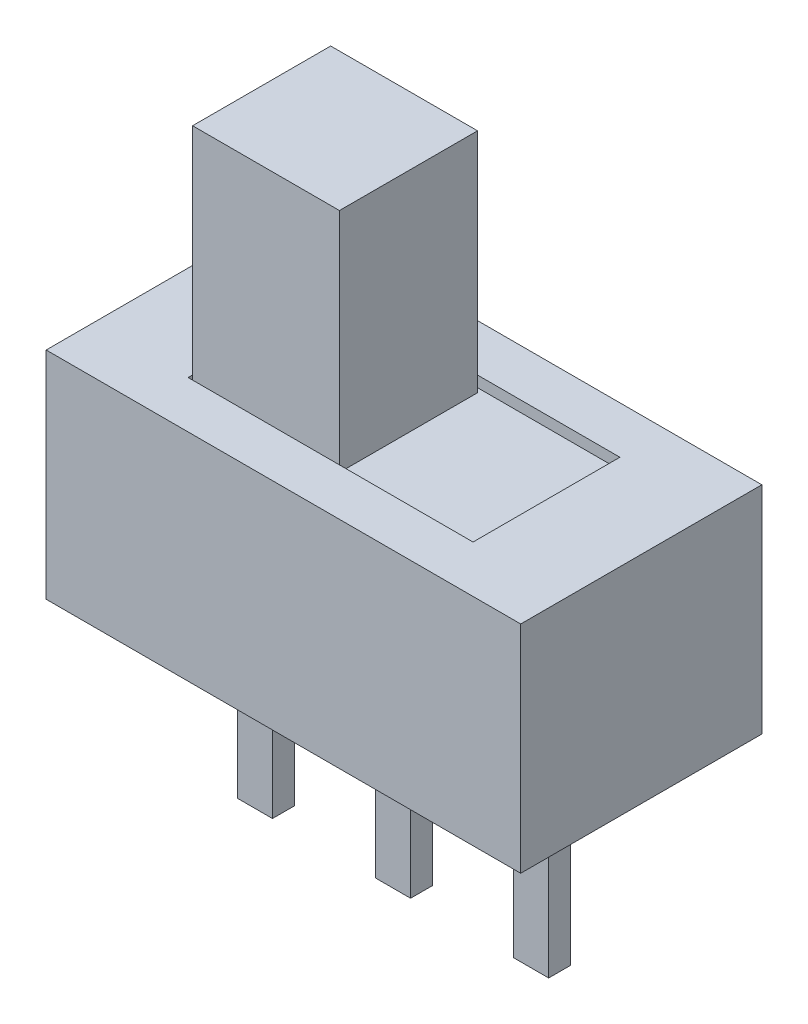
ISO-10303-21;
HEADER;
FILE_DESCRIPTION(('STEP AP214'),'2;1');
FILE_NAME('part.step','',(''),(''),'','','');
FILE_SCHEMA(('AUTOMOTIVE_DESIGN { 1 0 10303 214 1 1 1 1 }'));
ENDSEC;
DATA;
#1=APPLICATION_CONTEXT('core data for automotive mechanical design processes');
#2=APPLICATION_PROTOCOL_DEFINITION('international standard','automotive_design',2000,#1);
#3=PRODUCT_CONTEXT('',#1,'mechanical');
#4=PRODUCT('Part','Part','',(#3));
#5=PRODUCT_RELATED_PRODUCT_CATEGORY('part','',(#4));
#6=PRODUCT_DEFINITION_FORMATION('','',#4);
#7=PRODUCT_DEFINITION_CONTEXT('part definition',#1,'design');
#8=PRODUCT_DEFINITION('design','',#6,#7);
#9=PRODUCT_DEFINITION_SHAPE('','',#8);
#10=(LENGTH_UNIT() NAMED_UNIT(*) SI_UNIT(.MILLI.,.METRE.));
#11=(NAMED_UNIT(*) PLANE_ANGLE_UNIT() SI_UNIT($,.RADIAN.));
#12=(NAMED_UNIT(*) SI_UNIT($,.STERADIAN.) SOLID_ANGLE_UNIT());
#13=UNCERTAINTY_MEASURE_WITH_UNIT(LENGTH_MEASURE(1.E-05),#10,'distance_accuracy_value','');
#14=(GEOMETRIC_REPRESENTATION_CONTEXT(3) GLOBAL_UNCERTAINTY_ASSIGNED_CONTEXT((#13)) GLOBAL_UNIT_ASSIGNED_CONTEXT((#10,
#11,#12)) REPRESENTATION_CONTEXT('',''));
#15=CARTESIAN_POINT('',(0.,0.,0.));
#16=DIRECTION('',(0.,0.,1.));
#17=DIRECTION('',(1.,0.,0.));
#18=AXIS2_PLACEMENT_3D('',#15,#16,#17);
#19=CARTESIAN_POINT('',(0.,0.,0.));
#20=DIRECTION('',(0.,1.,0.));
#21=DIRECTION('',(0.,0.,1.));
#22=AXIS2_PLACEMENT_3D('',#19,#20,#21);
#23=PLANE('',#22);
#24=DIRECTION('',(0.,0.,1.));
#25=VECTOR('',#24,1.);
#26=CARTESIAN_POINT('',(3.6068,0.,0.254));
#27=LINE('',#26,#25);
#28=CARTESIAN_POINT('',(3.6068,0.,-0.254));
#29=VERTEX_POINT('',#28);
#30=CARTESIAN_POINT('',(3.6068,0.,0.254));
#31=VERTEX_POINT('',#30);
#32=EDGE_CURVE('E251',#29,#31,#27,.T.);
#33=ORIENTED_EDGE('',*,*,#32,.F.);
#34=DIRECTION('',(1.,0.,0.));
#35=VECTOR('',#34,1.);
#36=CARTESIAN_POINT('',(2.794,0.,-0.254));
#37=LINE('',#36,#35);
#38=CARTESIAN_POINT('',(2.794,0.,-0.254));
#39=VERTEX_POINT('',#38);
#40=EDGE_CURVE('E217',#39,#29,#37,.T.);
#41=ORIENTED_EDGE('',*,*,#40,.F.);
#42=DIRECTION('',(0.,0.,-1.));
#43=VECTOR('',#42,1.);
#44=CARTESIAN_POINT('',(2.794,0.,0.254));
#45=LINE('',#44,#43);
#46=CARTESIAN_POINT('',(2.794,0.,0.254));
#47=VERTEX_POINT('',#46);
#48=EDGE_CURVE('E239',#47,#39,#45,.T.);
#49=ORIENTED_EDGE('',*,*,#48,.F.);
#50=DIRECTION('',(-1.,0.,0.));
#51=VECTOR('',#50,1.);
#52=CARTESIAN_POINT('',(2.794,0.,0.254));
#53=LINE('',#52,#51);
#54=EDGE_CURVE('E245',#31,#47,#53,.T.);
#55=ORIENTED_EDGE('',*,*,#54,.F.);
#56=EDGE_LOOP('',(#33,#41,#49,#55));
#57=FACE_BOUND('',#56,.T.);
#58=DIRECTION('',(0.,0.,-1.));
#59=VECTOR('',#58,1.);
#60=CARTESIAN_POINT('',(5.4991,0.,-2.794));
#61=LINE('',#60,#59);
#62=CARTESIAN_POINT('',(5.4991,0.,2.794));
#63=VERTEX_POINT('',#62);
#64=CARTESIAN_POINT('',(5.4991,0.,-2.794));
#65=VERTEX_POINT('',#64);
#66=EDGE_CURVE('E342',#63,#65,#61,.T.);
#67=ORIENTED_EDGE('',*,*,#66,.F.);
#68=DIRECTION('',(1.,0.,0.));
#69=VECTOR('',#68,1.);
#70=CARTESIAN_POINT('',(-5.4991,0.,2.794));
#71=LINE('',#70,#69);
#72=CARTESIAN_POINT('',(-5.4991,0.,2.794));
#73=VERTEX_POINT('',#72);
#74=EDGE_CURVE('E353',#73,#63,#71,.T.);
#75=ORIENTED_EDGE('',*,*,#74,.F.);
#76=DIRECTION('',(0.,0.,1.));
#77=VECTOR('',#76,1.);
#78=CARTESIAN_POINT('',(-5.4991,0.,-2.794));
#79=LINE('',#78,#77);
#80=CARTESIAN_POINT('',(-5.4991,0.,-2.794));
#81=VERTEX_POINT('',#80);
#82=EDGE_CURVE('E364',#81,#73,#79,.T.);
#83=ORIENTED_EDGE('',*,*,#82,.F.);
#84=DIRECTION('',(-1.,0.,0.));
#85=VECTOR('',#84,1.);
#86=CARTESIAN_POINT('',(-5.4991,0.,-2.794));
#87=LINE('',#86,#85);
#88=EDGE_CURVE('E362',#65,#81,#87,.T.);
#89=ORIENTED_EDGE('',*,*,#88,.F.);
#90=EDGE_LOOP('',(#67,#75,#83,#89));
#91=FACE_BOUND('',#90,.T.);
#92=DIRECTION('',(0.,0.,1.));
#93=VECTOR('',#92,1.);
#94=CARTESIAN_POINT('',(0.4064,0.,0.254));
#95=LINE('',#94,#93);
#96=CARTESIAN_POINT('',(0.4064,0.,-0.254));
#97=VERTEX_POINT('',#96);
#98=CARTESIAN_POINT('',(0.4064,0.,0.254));
#99=VERTEX_POINT('',#98);
#100=EDGE_CURVE('E254',#97,#99,#95,.T.);
#101=ORIENTED_EDGE('',*,*,#100,.F.);
#102=DIRECTION('',(1.,0.,0.));
#103=VECTOR('',#102,1.);
#104=CARTESIAN_POINT('',(-0.4064,0.,-0.254));
#105=LINE('',#104,#103);
#106=CARTESIAN_POINT('',(-0.4064,0.,-0.254));
#107=VERTEX_POINT('',#106);
#108=EDGE_CURVE('E259',#107,#97,#105,.T.);
#109=ORIENTED_EDGE('',*,*,#108,.F.);
#110=DIRECTION('',(0.,0.,-1.));
#111=VECTOR('',#110,1.);
#112=CARTESIAN_POINT('',(-0.4064,0.,0.254));
#113=LINE('',#112,#111);
#114=CARTESIAN_POINT('',(-0.4064,0.,0.254));
#115=VERTEX_POINT('',#114);
#116=EDGE_CURVE('E271',#115,#107,#113,.T.);
#117=ORIENTED_EDGE('',*,*,#116,.F.);
#118=DIRECTION('',(-1.,0.,0.));
#119=VECTOR('',#118,1.);
#120=CARTESIAN_POINT('',(-0.4064,0.,0.254));
#121=LINE('',#120,#119);
#122=EDGE_CURVE('E268',#99,#115,#121,.T.);
#123=ORIENTED_EDGE('',*,*,#122,.F.);
#124=EDGE_LOOP('',(#101,#109,#117,#123));
#125=FACE_BOUND('',#124,.T.);
#126=DIRECTION('',(0.,0.,1.));
#127=VECTOR('',#126,1.);
#128=CARTESIAN_POINT('',(-2.794,0.,0.254));
#129=LINE('',#128,#127);
#130=CARTESIAN_POINT('',(-2.794,0.,-0.254));
#131=VERTEX_POINT('',#130);
#132=CARTESIAN_POINT('',(-2.794,0.,0.254));
#133=VERTEX_POINT('',#132);
#134=EDGE_CURVE('E215',#131,#133,#129,.T.);
#135=ORIENTED_EDGE('',*,*,#134,.F.);
#136=DIRECTION('',(1.,0.,0.));
#137=VECTOR('',#136,1.);
#138=CARTESIAN_POINT('',(-3.6068,0.,-0.254));
#139=LINE('',#138,#137);
#140=CARTESIAN_POINT('',(-3.6068,0.,-0.254));
#141=VERTEX_POINT('',#140);
#142=EDGE_CURVE('E204',#141,#131,#139,.T.);
#143=ORIENTED_EDGE('',*,*,#142,.F.);
#144=DIRECTION('',(0.,0.,-1.));
#145=VECTOR('',#144,1.);
#146=CARTESIAN_POINT('',(-3.6068,0.,0.254));
#147=LINE('',#146,#145);
#148=CARTESIAN_POINT('',(-3.6068,0.,0.254));
#149=VERTEX_POINT('',#148);
#150=EDGE_CURVE('E54',#149,#141,#147,.T.);
#151=ORIENTED_EDGE('',*,*,#150,.F.);
#152=DIRECTION('',(-1.,0.,0.));
#153=VECTOR('',#152,1.);
#154=CARTESIAN_POINT('',(-3.6068,0.,0.254));
#155=LINE('',#154,#153);
#156=EDGE_CURVE('E49',#133,#149,#155,.T.);
#157=ORIENTED_EDGE('',*,*,#156,.F.);
#158=EDGE_LOOP('',(#135,#143,#151,#157));
#159=FACE_BOUND('',#158,.T.);
#160=ADVANCED_FACE('F34',(#57,#91,#125,#159),#23,.F.);
#161=CARTESIAN_POINT('',(0.,4.7498,0.));
#162=DIRECTION('',(0.,1.,0.));
#163=DIRECTION('',(0.,0.,1.));
#164=AXIS2_PLACEMENT_3D('',#161,#162,#163);
#165=PLANE('',#164);
#166=DIRECTION('',(0.,0.,-1.));
#167=VECTOR('',#166,1.);
#168=CARTESIAN_POINT('',(3.302,4.7498,-1.7018));
#169=LINE('',#168,#167);
#170=CARTESIAN_POINT('',(3.302,4.7498,1.7018));
#171=VERTEX_POINT('',#170);
#172=CARTESIAN_POINT('',(3.302,4.7498,-1.7018));
#173=VERTEX_POINT('',#172);
#174=EDGE_CURVE('E317',#171,#173,#169,.T.);
#175=ORIENTED_EDGE('',*,*,#174,.T.);
#176=DIRECTION('',(-1.,0.,0.));
#177=VECTOR('',#176,1.);
#178=CARTESIAN_POINT('',(-3.302,4.7498,-1.7018));
#179=LINE('',#178,#177);
#180=CARTESIAN_POINT('',(-3.302,4.7498,-1.7018));
#181=VERTEX_POINT('',#180);
#182=EDGE_CURVE('E320',#173,#181,#179,.T.);
#183=ORIENTED_EDGE('',*,*,#182,.T.);
#184=DIRECTION('',(0.,0.,1.));
#185=VECTOR('',#184,1.);
#186=CARTESIAN_POINT('',(-3.302,4.7498,-1.7018));
#187=LINE('',#186,#185);
#188=CARTESIAN_POINT('',(-3.302,4.7498,1.7018));
#189=VERTEX_POINT('',#188);
#190=EDGE_CURVE('E324',#181,#189,#187,.T.);
#191=ORIENTED_EDGE('',*,*,#190,.T.);
#192=DIRECTION('',(1.,0.,0.));
#193=VECTOR('',#192,1.);
#194=CARTESIAN_POINT('',(-3.302,4.7498,1.7018));
#195=LINE('',#194,#193);
#196=EDGE_CURVE('E327',#189,#171,#195,.T.);
#197=ORIENTED_EDGE('',*,*,#196,.T.);
#198=EDGE_LOOP('',(#175,#183,#191,#197));
#199=FACE_BOUND('',#198,.T.);
#200=DIRECTION('',(-1.,0.,0.));
#201=VECTOR('',#200,1.);
#202=CARTESIAN_POINT('',(-3.29946,4.7498,-1.6002));
#203=LINE('',#202,#201);
#204=CARTESIAN_POINT('',(0.10414,4.7498,-1.6002));
#205=VERTEX_POINT('',#204);
#206=CARTESIAN_POINT('',(-3.29946,4.7498,-1.6002));
#207=VERTEX_POINT('',#206);
#208=EDGE_CURVE('E301',#205,#207,#203,.T.);
#209=ORIENTED_EDGE('',*,*,#208,.F.);
#210=DIRECTION('',(0.,0.,-1.));
#211=VECTOR('',#210,1.);
#212=CARTESIAN_POINT('',(0.10414,4.7498,-1.6002));
#213=LINE('',#212,#211);
#214=CARTESIAN_POINT('',(0.10414,4.7498,1.6002));
#215=VERTEX_POINT('',#214);
#216=EDGE_CURVE('E287',#215,#205,#213,.T.);
#217=ORIENTED_EDGE('',*,*,#216,.F.);
#218=DIRECTION('',(1.,0.,0.));
#219=VECTOR('',#218,1.);
#220=CARTESIAN_POINT('',(-3.29946,4.7498,1.6002));
#221=LINE('',#220,#219);
#222=CARTESIAN_POINT('',(-3.29946,4.7498,1.6002));
#223=VERTEX_POINT('',#222);
#224=EDGE_CURVE('E292',#223,#215,#221,.T.);
#225=ORIENTED_EDGE('',*,*,#224,.F.);
#226=DIRECTION('',(0.,0.,1.));
#227=VECTOR('',#226,1.);
#228=CARTESIAN_POINT('',(-3.29946,4.7498,-1.6002));
#229=LINE('',#228,#227);
#230=EDGE_CURVE('E303',#207,#223,#229,.T.);
#231=ORIENTED_EDGE('',*,*,#230,.F.);
#232=EDGE_LOOP('',(#209,#217,#225,#231));
#233=FACE_BOUND('',#232,.T.);
#234=ADVANCED_FACE('F399',(#199,#233),#165,.T.);
#235=CARTESIAN_POINT('',(5.4991,5.0038,-2.794));
#236=DIRECTION('',(-1.,0.,0.));
#237=DIRECTION('',(0.,0.,1.));
#238=AXIS2_PLACEMENT_3D('',#235,#236,#237);
#239=PLANE('',#238);
#240=ORIENTED_EDGE('',*,*,#66,.T.);
#241=DIRECTION('',(0.,-1.,0.));
#242=VECTOR('',#241,1.);
#243=CARTESIAN_POINT('',(5.4991,5.0038,-2.794));
#244=LINE('',#243,#242);
#245=CARTESIAN_POINT('',(5.4991,5.0038,-2.794));
#246=VERTEX_POINT('',#245);
#247=EDGE_CURVE('E11',#246,#65,#244,.T.);
#248=ORIENTED_EDGE('',*,*,#247,.F.);
#249=DIRECTION('',(0.,0.,-1.));
#250=VECTOR('',#249,1.);
#251=CARTESIAN_POINT('',(5.4991,5.0038,-2.794));
#252=LINE('',#251,#250);
#253=CARTESIAN_POINT('',(5.4991,5.0038,2.794));
#254=VERTEX_POINT('',#253);
#255=EDGE_CURVE('E349',#254,#246,#252,.T.);
#256=ORIENTED_EDGE('',*,*,#255,.F.);
#257=DIRECTION('',(0.,-1.,0.));
#258=VECTOR('',#257,1.);
#259=CARTESIAN_POINT('',(5.4991,5.0038,2.794));
#260=LINE('',#259,#258);
#261=EDGE_CURVE('E359',#254,#63,#260,.T.);
#262=ORIENTED_EDGE('',*,*,#261,.T.);
#263=EDGE_LOOP('',(#240,#248,#256,#262));
#264=FACE_BOUND('',#263,.T.);
#265=ADVANCED_FACE('F36',(#264),#239,.F.);
#266=CARTESIAN_POINT('',(-5.4991,5.0038,-2.794));
#267=DIRECTION('',(0.,0.,1.));
#268=DIRECTION('',(1.,0.,0.));
#269=AXIS2_PLACEMENT_3D('',#266,#267,#268);
#270=PLANE('',#269);
#271=ORIENTED_EDGE('',*,*,#88,.T.);
#272=DIRECTION('',(0.,-1.,0.));
#273=VECTOR('',#272,1.);
#274=CARTESIAN_POINT('',(-5.4991,5.0038,-2.794));
#275=LINE('',#274,#273);
#276=CARTESIAN_POINT('',(-5.4991,5.0038,-2.794));
#277=VERTEX_POINT('',#276);
#278=EDGE_CURVE('E42',#277,#81,#275,.T.);
#279=ORIENTED_EDGE('',*,*,#278,.F.);
#280=DIRECTION('',(-1.,0.,0.));
#281=VECTOR('',#280,1.);
#282=CARTESIAN_POINT('',(-5.4991,5.0038,-2.794));
#283=LINE('',#282,#281);
#284=EDGE_CURVE('E352',#246,#277,#283,.T.);
#285=ORIENTED_EDGE('',*,*,#284,.F.);
#286=ORIENTED_EDGE('',*,*,#247,.T.);
#287=EDGE_LOOP('',(#271,#279,#285,#286));
#288=FACE_BOUND('',#287,.T.);
#289=ADVANCED_FACE('F392',(#288),#270,.F.);
#290=CARTESIAN_POINT('',(-5.4991,5.0038,-2.794));
#291=DIRECTION('',(1.,0.,0.));
#292=DIRECTION('',(0.,0.,-1.));
#293=AXIS2_PLACEMENT_3D('',#290,#291,#292);
#294=PLANE('',#293);
#295=ORIENTED_EDGE('',*,*,#82,.T.);
#296=DIRECTION('',(0.,-1.,0.));
#297=VECTOR('',#296,1.);
#298=CARTESIAN_POINT('',(-5.4991,5.0038,2.794));
#299=LINE('',#298,#297);
#300=CARTESIAN_POINT('',(-5.4991,5.0038,2.794));
#301=VERTEX_POINT('',#300);
#302=EDGE_CURVE('E369',#301,#73,#299,.T.);
#303=ORIENTED_EDGE('',*,*,#302,.F.);
#304=DIRECTION('',(0.,0.,1.));
#305=VECTOR('',#304,1.);
#306=CARTESIAN_POINT('',(-5.4991,5.0038,-2.794));
#307=LINE('',#306,#305);
#308=EDGE_CURVE('E355',#277,#301,#307,.T.);
#309=ORIENTED_EDGE('',*,*,#308,.F.);
#310=ORIENTED_EDGE('',*,*,#278,.T.);
#311=EDGE_LOOP('',(#295,#303,#309,#310));
#312=FACE_BOUND('',#311,.T.);
#313=ADVANCED_FACE('F376',(#312),#294,.F.);
#314=CARTESIAN_POINT('',(-5.4991,5.0038,2.794));
#315=DIRECTION('',(0.,0.,-1.));
#316=DIRECTION('',(-1.,0.,0.));
#317=AXIS2_PLACEMENT_3D('',#314,#315,#316);
#318=PLANE('',#317);
#319=ORIENTED_EDGE('',*,*,#74,.T.);
#320=ORIENTED_EDGE('',*,*,#261,.F.);
#321=DIRECTION('',(1.,0.,0.));
#322=VECTOR('',#321,1.);
#323=CARTESIAN_POINT('',(-5.4991,5.0038,2.794));
#324=LINE('',#323,#322);
#325=EDGE_CURVE('E357',#301,#254,#324,.T.);
#326=ORIENTED_EDGE('',*,*,#325,.F.);
#327=ORIENTED_EDGE('',*,*,#302,.T.);
#328=EDGE_LOOP('',(#319,#320,#326,#327));
#329=FACE_BOUND('',#328,.T.);
#330=ADVANCED_FACE('F385',(#329),#318,.F.);
#331=CARTESIAN_POINT('',(0.,5.0038,0.));
#332=DIRECTION('',(0.,1.,0.));
#333=DIRECTION('',(0.,0.,1.));
#334=AXIS2_PLACEMENT_3D('',#331,#332,#333);
#335=PLANE('',#334);
#336=DIRECTION('',(0.,0.,-1.));
#337=VECTOR('',#336,1.);
#338=CARTESIAN_POINT('',(3.302,5.0038,-1.7018));
#339=LINE('',#338,#337);
#340=CARTESIAN_POINT('',(3.302,5.0038,1.7018));
#341=VERTEX_POINT('',#340);
#342=CARTESIAN_POINT('',(3.302,5.0038,-1.7018));
#343=VERTEX_POINT('',#342);
#344=EDGE_CURVE('E316',#341,#343,#339,.T.);
#345=ORIENTED_EDGE('',*,*,#344,.F.);
#346=DIRECTION('',(1.,0.,0.));
#347=VECTOR('',#346,1.);
#348=CARTESIAN_POINT('',(-3.302,5.0038,1.7018));
#349=LINE('',#348,#347);
#350=CARTESIAN_POINT('',(-3.302,5.0038,1.7018));
#351=VERTEX_POINT('',#350);
#352=EDGE_CURVE('E321',#351,#341,#349,.T.);
#353=ORIENTED_EDGE('',*,*,#352,.F.);
#354=DIRECTION('',(0.,0.,1.));
#355=VECTOR('',#354,1.);
#356=CARTESIAN_POINT('',(-3.302,5.0038,-1.7018));
#357=LINE('',#356,#355);
#358=CARTESIAN_POINT('',(-3.302,5.0038,-1.7018));
#359=VERTEX_POINT('',#358);
#360=EDGE_CURVE('E335',#359,#351,#357,.T.);
#361=ORIENTED_EDGE('',*,*,#360,.F.);
#362=DIRECTION('',(-1.,0.,0.));
#363=VECTOR('',#362,1.);
#364=CARTESIAN_POINT('',(-3.302,5.0038,-1.7018));
#365=LINE('',#364,#363);
#366=EDGE_CURVE('E332',#343,#359,#365,.T.);
#367=ORIENTED_EDGE('',*,*,#366,.F.);
#368=EDGE_LOOP('',(#345,#353,#361,#367));
#369=FACE_BOUND('',#368,.T.);
#370=ORIENTED_EDGE('',*,*,#255,.T.);
#371=ORIENTED_EDGE('',*,*,#284,.T.);
#372=ORIENTED_EDGE('',*,*,#308,.T.);
#373=ORIENTED_EDGE('',*,*,#325,.T.);
#374=EDGE_LOOP('',(#370,#371,#372,#373));
#375=FACE_BOUND('',#374,.T.);
#376=ADVANCED_FACE('F391',(#369,#375),#335,.T.);
#377=CARTESIAN_POINT('',(3.302,4.7498,-1.7018));
#378=DIRECTION('',(1.,0.,0.));
#379=DIRECTION('',(0.,0.,-1.));
#380=AXIS2_PLACEMENT_3D('',#377,#378,#379);
#381=PLANE('',#380);
#382=ORIENTED_EDGE('',*,*,#344,.T.);
#383=DIRECTION('',(0.,1.,0.));
#384=VECTOR('',#383,1.);
#385=CARTESIAN_POINT('',(3.302,4.7498,-1.7018));
#386=LINE('',#385,#384);
#387=EDGE_CURVE('E330',#173,#343,#386,.T.);
#388=ORIENTED_EDGE('',*,*,#387,.F.);
#389=ORIENTED_EDGE('',*,*,#174,.F.);
#390=DIRECTION('',(0.,1.,0.));
#391=VECTOR('',#390,1.);
#392=CARTESIAN_POINT('',(3.302,4.7498,1.7018));
#393=LINE('',#392,#391);
#394=EDGE_CURVE('E340',#171,#341,#393,.T.);
#395=ORIENTED_EDGE('',*,*,#394,.T.);
#396=EDGE_LOOP('',(#382,#388,#389,#395));
#397=FACE_BOUND('',#396,.T.);
#398=ADVANCED_FACE('F415',(#397),#381,.F.);
#399=CARTESIAN_POINT('',(-3.302,4.7498,1.7018));
#400=DIRECTION('',(0.,0.,1.));
#401=DIRECTION('',(1.,0.,0.));
#402=AXIS2_PLACEMENT_3D('',#399,#400,#401);
#403=PLANE('',#402);
#404=ORIENTED_EDGE('',*,*,#352,.T.);
#405=ORIENTED_EDGE('',*,*,#394,.F.);
#406=ORIENTED_EDGE('',*,*,#196,.F.);
#407=DIRECTION('',(0.,1.,0.));
#408=VECTOR('',#407,1.);
#409=CARTESIAN_POINT('',(-3.302,4.7498,1.7018));
#410=LINE('',#409,#408);
#411=EDGE_CURVE('E343',#189,#351,#410,.T.);
#412=ORIENTED_EDGE('',*,*,#411,.T.);
#413=EDGE_LOOP('',(#404,#405,#406,#412));
#414=FACE_BOUND('',#413,.T.);
#415=ADVANCED_FACE('F420',(#414),#403,.F.);
#416=CARTESIAN_POINT('',(-3.302,4.7498,-1.7018));
#417=DIRECTION('',(-1.,0.,0.));
#418=DIRECTION('',(0.,0.,1.));
#419=AXIS2_PLACEMENT_3D('',#416,#417,#418);
#420=PLANE('',#419);
#421=ORIENTED_EDGE('',*,*,#360,.T.);
#422=ORIENTED_EDGE('',*,*,#411,.F.);
#423=ORIENTED_EDGE('',*,*,#190,.F.);
#424=DIRECTION('',(0.,1.,0.));
#425=VECTOR('',#424,1.);
#426=CARTESIAN_POINT('',(-3.302,4.7498,-1.7018));
#427=LINE('',#426,#425);
#428=EDGE_CURVE('E345',#181,#359,#427,.T.);
#429=ORIENTED_EDGE('',*,*,#428,.T.);
#430=EDGE_LOOP('',(#421,#422,#423,#429));
#431=FACE_BOUND('',#430,.T.);
#432=ADVANCED_FACE('F435',(#431),#420,.F.);
#433=CARTESIAN_POINT('',(-3.302,4.7498,-1.7018));
#434=DIRECTION('',(0.,0.,-1.));
#435=DIRECTION('',(-1.,0.,0.));
#436=AXIS2_PLACEMENT_3D('',#433,#434,#435);
#437=PLANE('',#436);
#438=ORIENTED_EDGE('',*,*,#366,.T.);
#439=ORIENTED_EDGE('',*,*,#428,.F.);
#440=ORIENTED_EDGE('',*,*,#182,.F.);
#441=ORIENTED_EDGE('',*,*,#387,.T.);
#442=EDGE_LOOP('',(#438,#439,#440,#441));
#443=FACE_BOUND('',#442,.T.);
#444=ADVANCED_FACE('F429',(#443),#437,.F.);
#445=CARTESIAN_POINT('',(0.10414,10.0076,-1.6002));
#446=DIRECTION('',(-1.,0.,0.));
#447=DIRECTION('',(0.,0.,1.));
#448=AXIS2_PLACEMENT_3D('',#445,#446,#447);
#449=PLANE('',#448);
#450=ORIENTED_EDGE('',*,*,#216,.T.);
#451=DIRECTION('',(0.,-1.,0.));
#452=VECTOR('',#451,1.);
#453=CARTESIAN_POINT('',(0.10414,10.0076,-1.6002));
#454=LINE('',#453,#452);
#455=CARTESIAN_POINT('',(0.10414,10.0076,-1.6002));
#456=VERTEX_POINT('',#455);
#457=EDGE_CURVE('E314',#456,#205,#454,.T.);
#458=ORIENTED_EDGE('',*,*,#457,.F.);
#459=DIRECTION('',(0.,0.,-1.));
#460=VECTOR('',#459,1.);
#461=CARTESIAN_POINT('',(0.10414,10.0076,-1.6002));
#462=LINE('',#461,#460);
#463=CARTESIAN_POINT('',(0.10414,10.0076,1.6002));
#464=VERTEX_POINT('',#463);
#465=EDGE_CURVE('E288',#464,#456,#462,.T.);
#466=ORIENTED_EDGE('',*,*,#465,.F.);
#467=DIRECTION('',(0.,-1.,0.));
#468=VECTOR('',#467,1.);
#469=CARTESIAN_POINT('',(0.10414,10.0076,1.6002));
#470=LINE('',#469,#468);
#471=EDGE_CURVE('E298',#464,#215,#470,.T.);
#472=ORIENTED_EDGE('',*,*,#471,.T.);
#473=EDGE_LOOP('',(#450,#458,#466,#472));
#474=FACE_BOUND('',#473,.T.);
#475=ADVANCED_FACE('F442',(#474),#449,.F.);
#476=CARTESIAN_POINT('',(-3.29946,10.0076,-1.6002));
#477=DIRECTION('',(0.,0.,1.));
#478=DIRECTION('',(1.,0.,0.));
#479=AXIS2_PLACEMENT_3D('',#476,#477,#478);
#480=PLANE('',#479);
#481=ORIENTED_EDGE('',*,*,#208,.T.);
#482=DIRECTION('',(0.,-1.,0.));
#483=VECTOR('',#482,1.);
#484=CARTESIAN_POINT('',(-3.29946,10.0076,-1.6002));
#485=LINE('',#484,#483);
#486=CARTESIAN_POINT('',(-3.29946,10.0076,-1.6002));
#487=VERTEX_POINT('',#486);
#488=EDGE_CURVE('E311',#487,#207,#485,.T.);
#489=ORIENTED_EDGE('',*,*,#488,.F.);
#490=DIRECTION('',(-1.,0.,0.));
#491=VECTOR('',#490,1.);
#492=CARTESIAN_POINT('',(-3.29946,10.0076,-1.6002));
#493=LINE('',#492,#491);
#494=EDGE_CURVE('E291',#456,#487,#493,.T.);
#495=ORIENTED_EDGE('',*,*,#494,.F.);
#496=ORIENTED_EDGE('',*,*,#457,.T.);
#497=EDGE_LOOP('',(#481,#489,#495,#496));
#498=FACE_BOUND('',#497,.T.);
#499=ADVANCED_FACE('F448',(#498),#480,.F.);
#500=CARTESIAN_POINT('',(-3.29946,10.0076,-1.6002));
#501=DIRECTION('',(1.,0.,0.));
#502=DIRECTION('',(0.,0.,-1.));
#503=AXIS2_PLACEMENT_3D('',#500,#501,#502);
#504=PLANE('',#503);
#505=ORIENTED_EDGE('',*,*,#230,.T.);
#506=DIRECTION('',(0.,-1.,0.));
#507=VECTOR('',#506,1.);
#508=CARTESIAN_POINT('',(-3.29946,10.0076,1.6002));
#509=LINE('',#508,#507);
#510=CARTESIAN_POINT('',(-3.29946,10.0076,1.6002));
#511=VERTEX_POINT('',#510);
#512=EDGE_CURVE('E309',#511,#223,#509,.T.);
#513=ORIENTED_EDGE('',*,*,#512,.F.);
#514=DIRECTION('',(0.,0.,1.));
#515=VECTOR('',#514,1.);
#516=CARTESIAN_POINT('',(-3.29946,10.0076,-1.6002));
#517=LINE('',#516,#515);
#518=EDGE_CURVE('E294',#487,#511,#517,.T.);
#519=ORIENTED_EDGE('',*,*,#518,.F.);
#520=ORIENTED_EDGE('',*,*,#488,.T.);
#521=EDGE_LOOP('',(#505,#513,#519,#520));
#522=FACE_BOUND('',#521,.T.);
#523=ADVANCED_FACE('F452',(#522),#504,.F.);
#524=CARTESIAN_POINT('',(-3.29946,10.0076,1.6002));
#525=DIRECTION('',(0.,0.,-1.));
#526=DIRECTION('',(-1.,0.,0.));
#527=AXIS2_PLACEMENT_3D('',#524,#525,#526);
#528=PLANE('',#527);
#529=ORIENTED_EDGE('',*,*,#224,.T.);
#530=ORIENTED_EDGE('',*,*,#471,.F.);
#531=DIRECTION('',(1.,0.,0.));
#532=VECTOR('',#531,1.);
#533=CARTESIAN_POINT('',(-3.29946,10.0076,1.6002));
#534=LINE('',#533,#532);
#535=EDGE_CURVE('E296',#511,#464,#534,.T.);
#536=ORIENTED_EDGE('',*,*,#535,.F.);
#537=ORIENTED_EDGE('',*,*,#512,.T.);
#538=EDGE_LOOP('',(#529,#530,#536,#537));
#539=FACE_BOUND('',#538,.T.);
#540=ADVANCED_FACE('F456',(#539),#528,.F.);
#541=CARTESIAN_POINT('',(0.,10.0076,0.));
#542=DIRECTION('',(0.,1.,0.));
#543=DIRECTION('',(0.,0.,1.));
#544=AXIS2_PLACEMENT_3D('',#541,#542,#543);
#545=PLANE('',#544);
#546=ORIENTED_EDGE('',*,*,#465,.T.);
#547=ORIENTED_EDGE('',*,*,#494,.T.);
#548=ORIENTED_EDGE('',*,*,#518,.T.);
#549=ORIENTED_EDGE('',*,*,#535,.T.);
#550=EDGE_LOOP('',(#546,#547,#548,#549));
#551=FACE_BOUND('',#550,.T.);
#552=ADVANCED_FACE('F460',(#551),#545,.T.);
#553=CARTESIAN_POINT('',(0.4064,-4.318,0.254));
#554=DIRECTION('',(-1.,0.,0.));
#555=DIRECTION('',(0.,0.,1.));
#556=AXIS2_PLACEMENT_3D('',#553,#554,#555);
#557=PLANE('',#556);
#558=ORIENTED_EDGE('',*,*,#100,.T.);
#559=DIRECTION('',(0.,1.,0.));
#560=VECTOR('',#559,1.);
#561=CARTESIAN_POINT('',(0.4064,-4.318,0.254));
#562=LINE('',#561,#560);
#563=CARTESIAN_POINT('',(0.4064,-4.318,0.254));
#564=VERTEX_POINT('',#563);
#565=EDGE_CURVE('E284',#564,#99,#562,.T.);
#566=ORIENTED_EDGE('',*,*,#565,.F.);
#567=DIRECTION('',(0.,0.,1.));
#568=VECTOR('',#567,1.);
#569=CARTESIAN_POINT('',(0.4064,-4.318,0.254));
#570=LINE('',#569,#568);
#571=CARTESIAN_POINT('',(0.4064,-4.318,-0.254));
#572=VERTEX_POINT('',#571);
#573=EDGE_CURVE('E255',#572,#564,#570,.T.);
#574=ORIENTED_EDGE('',*,*,#573,.F.);
#575=DIRECTION('',(0.,1.,0.));
#576=VECTOR('',#575,1.);
#577=CARTESIAN_POINT('',(0.4064,-4.318,-0.254));
#578=LINE('',#577,#576);
#579=EDGE_CURVE('E265',#572,#97,#578,.T.);
#580=ORIENTED_EDGE('',*,*,#579,.T.);
#581=EDGE_LOOP('',(#558,#566,#574,#580));
#582=FACE_BOUND('',#581,.T.);
#583=ADVANCED_FACE('F464',(#582),#557,.F.);
#584=CARTESIAN_POINT('',(-0.4064,-4.318,0.254));
#585=DIRECTION('',(0.,0.,-1.));
#586=DIRECTION('',(-1.,0.,0.));
#587=AXIS2_PLACEMENT_3D('',#584,#585,#586);
#588=PLANE('',#587);
#589=ORIENTED_EDGE('',*,*,#122,.T.);
#590=DIRECTION('',(0.,1.,0.));
#591=VECTOR('',#590,1.);
#592=CARTESIAN_POINT('',(-0.4064,-4.318,0.254));
#593=LINE('',#592,#591);
#594=CARTESIAN_POINT('',(-0.4064,-4.318,0.254));
#595=VERTEX_POINT('',#594);
#596=EDGE_CURVE('E281',#595,#115,#593,.T.);
#597=ORIENTED_EDGE('',*,*,#596,.F.);
#598=DIRECTION('',(-1.,0.,0.));
#599=VECTOR('',#598,1.);
#600=CARTESIAN_POINT('',(-0.4064,-4.318,0.254));
#601=LINE('',#600,#599);
#602=EDGE_CURVE('E258',#564,#595,#601,.T.);
#603=ORIENTED_EDGE('',*,*,#602,.F.);
#604=ORIENTED_EDGE('',*,*,#565,.T.);
#605=EDGE_LOOP('',(#589,#597,#603,#604));
#606=FACE_BOUND('',#605,.T.);
#607=ADVANCED_FACE('F468',(#606),#588,.F.);
#608=CARTESIAN_POINT('',(-0.4064,-4.318,0.254));
#609=DIRECTION('',(1.,0.,0.));
#610=DIRECTION('',(0.,0.,-1.));
#611=AXIS2_PLACEMENT_3D('',#608,#609,#610);
#612=PLANE('',#611);
#613=ORIENTED_EDGE('',*,*,#116,.T.);
#614=DIRECTION('',(0.,1.,0.));
#615=VECTOR('',#614,1.);
#616=CARTESIAN_POINT('',(-0.4064,-4.318,-0.254));
#617=LINE('',#616,#615);
#618=CARTESIAN_POINT('',(-0.4064,-4.318,-0.254));
#619=VERTEX_POINT('',#618);
#620=EDGE_CURVE('E278',#619,#107,#617,.T.);
#621=ORIENTED_EDGE('',*,*,#620,.F.);
#622=DIRECTION('',(0.,0.,-1.));
#623=VECTOR('',#622,1.);
#624=CARTESIAN_POINT('',(-0.4064,-4.318,0.254));
#625=LINE('',#624,#623);
#626=EDGE_CURVE('E261',#595,#619,#625,.T.);
#627=ORIENTED_EDGE('',*,*,#626,.F.);
#628=ORIENTED_EDGE('',*,*,#596,.T.);
#629=EDGE_LOOP('',(#613,#621,#627,#628));
#630=FACE_BOUND('',#629,.T.);
#631=ADVANCED_FACE('F472',(#630),#612,.F.);
#632=CARTESIAN_POINT('',(-0.4064,-4.318,-0.254));
#633=DIRECTION('',(0.,0.,1.));
#634=DIRECTION('',(1.,0.,0.));
#635=AXIS2_PLACEMENT_3D('',#632,#633,#634);
#636=PLANE('',#635);
#637=ORIENTED_EDGE('',*,*,#108,.T.);
#638=ORIENTED_EDGE('',*,*,#579,.F.);
#639=DIRECTION('',(1.,0.,0.));
#640=VECTOR('',#639,1.);
#641=CARTESIAN_POINT('',(-0.4064,-4.318,-0.254));
#642=LINE('',#641,#640);
#643=EDGE_CURVE('E263',#619,#572,#642,.T.);
#644=ORIENTED_EDGE('',*,*,#643,.F.);
#645=ORIENTED_EDGE('',*,*,#620,.T.);
#646=EDGE_LOOP('',(#637,#638,#644,#645));
#647=FACE_BOUND('',#646,.T.);
#648=ADVANCED_FACE('F476',(#647),#636,.F.);
#649=CARTESIAN_POINT('',(0.,-4.318,0.));
#650=DIRECTION('',(0.,-1.,0.));
#651=DIRECTION('',(0.,0.,-1.));
#652=AXIS2_PLACEMENT_3D('',#649,#650,#651);
#653=PLANE('',#652);
#654=ORIENTED_EDGE('',*,*,#573,.T.);
#655=ORIENTED_EDGE('',*,*,#602,.T.);
#656=ORIENTED_EDGE('',*,*,#626,.T.);
#657=ORIENTED_EDGE('',*,*,#643,.T.);
#658=EDGE_LOOP('',(#654,#655,#656,#657));
#659=FACE_BOUND('',#658,.T.);
#660=ADVANCED_FACE('F480',(#659),#653,.T.);
#661=CARTESIAN_POINT('',(3.6068,-4.318,0.254));
#662=DIRECTION('',(-1.,0.,0.));
#663=DIRECTION('',(0.,0.,1.));
#664=AXIS2_PLACEMENT_3D('',#661,#662,#663);
#665=PLANE('',#664);
#666=ORIENTED_EDGE('',*,*,#32,.T.);
#667=DIRECTION('',(0.,1.,0.));
#668=VECTOR('',#667,1.);
#669=CARTESIAN_POINT('',(3.6068,-4.318,0.254));
#670=LINE('',#669,#668);
#671=CARTESIAN_POINT('',(3.6068,-4.318,0.254));
#672=VERTEX_POINT('',#671);
#673=EDGE_CURVE('E248',#672,#31,#670,.T.);
#674=ORIENTED_EDGE('',*,*,#673,.F.);
#675=DIRECTION('',(0.,0.,1.));
#676=VECTOR('',#675,1.);
#677=CARTESIAN_POINT('',(3.6068,-4.318,0.254));
#678=LINE('',#677,#676);
#679=CARTESIAN_POINT('',(3.6068,-4.318,-0.254));
#680=VERTEX_POINT('',#679);
#681=EDGE_CURVE('E224',#680,#672,#678,.T.);
#682=ORIENTED_EDGE('',*,*,#681,.F.);
#683=DIRECTION('',(0.,1.,0.));
#684=VECTOR('',#683,1.);
#685=CARTESIAN_POINT('',(3.6068,-4.318,-0.254));
#686=LINE('',#685,#684);
#687=EDGE_CURVE('E233',#680,#29,#686,.T.);
#688=ORIENTED_EDGE('',*,*,#687,.T.);
#689=EDGE_LOOP('',(#666,#674,#682,#688));
#690=FACE_BOUND('',#689,.T.);
#691=ADVANCED_FACE('F484',(#690),#665,.F.);
#692=CARTESIAN_POINT('',(2.794,-4.318,0.254));
#693=DIRECTION('',(0.,0.,-1.));
#694=DIRECTION('',(-1.,0.,0.));
#695=AXIS2_PLACEMENT_3D('',#692,#693,#694);
#696=PLANE('',#695);
#697=ORIENTED_EDGE('',*,*,#54,.T.);
#698=DIRECTION('',(0.,1.,0.));
#699=VECTOR('',#698,1.);
#700=CARTESIAN_POINT('',(2.794,-4.318,0.254));
#701=LINE('',#700,#699);
#702=CARTESIAN_POINT('',(2.794,-4.318,0.254));
#703=VERTEX_POINT('',#702);
#704=EDGE_CURVE('E242',#703,#47,#701,.T.);
#705=ORIENTED_EDGE('',*,*,#704,.F.);
#706=DIRECTION('',(-1.,0.,0.));
#707=VECTOR('',#706,1.);
#708=CARTESIAN_POINT('',(2.794,-4.318,0.254));
#709=LINE('',#708,#707);
#710=EDGE_CURVE('E226',#672,#703,#709,.T.);
#711=ORIENTED_EDGE('',*,*,#710,.F.);
#712=ORIENTED_EDGE('',*,*,#673,.T.);
#713=EDGE_LOOP('',(#697,#705,#711,#712));
#714=FACE_BOUND('',#713,.T.);
#715=ADVANCED_FACE('F488',(#714),#696,.F.);
#716=CARTESIAN_POINT('',(2.794,-4.318,0.254));
#717=DIRECTION('',(1.,0.,0.));
#718=DIRECTION('',(0.,0.,-1.));
#719=AXIS2_PLACEMENT_3D('',#716,#717,#718);
#720=PLANE('',#719);
#721=ORIENTED_EDGE('',*,*,#48,.T.);
#722=DIRECTION('',(0.,1.,0.));
#723=VECTOR('',#722,1.);
#724=CARTESIAN_POINT('',(2.794,-4.318,-0.254));
#725=LINE('',#724,#723);
#726=CARTESIAN_POINT('',(2.794,-4.318,-0.254));
#727=VERTEX_POINT('',#726);
#728=EDGE_CURVE('E236',#727,#39,#725,.T.);
#729=ORIENTED_EDGE('',*,*,#728,.F.);
#730=DIRECTION('',(0.,0.,-1.));
#731=VECTOR('',#730,1.);
#732=CARTESIAN_POINT('',(2.794,-4.318,0.254));
#733=LINE('',#732,#731);
#734=EDGE_CURVE('E228',#703,#727,#733,.T.);
#735=ORIENTED_EDGE('',*,*,#734,.F.);
#736=ORIENTED_EDGE('',*,*,#704,.T.);
#737=EDGE_LOOP('',(#721,#729,#735,#736));
#738=FACE_BOUND('',#737,.T.);
#739=ADVANCED_FACE('F492',(#738),#720,.F.);
#740=CARTESIAN_POINT('',(2.794,-4.318,-0.254));
#741=DIRECTION('',(0.,0.,1.));
#742=DIRECTION('',(1.,0.,0.));
#743=AXIS2_PLACEMENT_3D('',#740,#741,#742);
#744=PLANE('',#743);
#745=ORIENTED_EDGE('',*,*,#40,.T.);
#746=ORIENTED_EDGE('',*,*,#687,.F.);
#747=DIRECTION('',(1.,0.,0.));
#748=VECTOR('',#747,1.);
#749=CARTESIAN_POINT('',(2.794,-4.318,-0.254));
#750=LINE('',#749,#748);
#751=EDGE_CURVE('E230',#727,#680,#750,.T.);
#752=ORIENTED_EDGE('',*,*,#751,.F.);
#753=ORIENTED_EDGE('',*,*,#728,.T.);
#754=EDGE_LOOP('',(#745,#746,#752,#753));
#755=FACE_BOUND('',#754,.T.);
#756=ADVANCED_FACE('F496',(#755),#744,.F.);
#757=CARTESIAN_POINT('',(3.2004,-4.318,0.));
#758=DIRECTION('',(0.,-1.,0.));
#759=DIRECTION('',(0.,0.,-1.));
#760=AXIS2_PLACEMENT_3D('',#757,#758,#759);
#761=PLANE('',#760);
#762=ORIENTED_EDGE('',*,*,#681,.T.);
#763=ORIENTED_EDGE('',*,*,#710,.T.);
#764=ORIENTED_EDGE('',*,*,#734,.T.);
#765=ORIENTED_EDGE('',*,*,#751,.T.);
#766=EDGE_LOOP('',(#762,#763,#764,#765));
#767=FACE_BOUND('',#766,.T.);
#768=ADVANCED_FACE('F500',(#767),#761,.T.);
#769=CARTESIAN_POINT('',(-2.794,-4.318,0.254));
#770=DIRECTION('',(-1.,0.,0.));
#771=DIRECTION('',(0.,0.,1.));
#772=AXIS2_PLACEMENT_3D('',#769,#770,#771);
#773=PLANE('',#772);
#774=ORIENTED_EDGE('',*,*,#134,.T.);
#775=DIRECTION('',(0.,1.,0.));
#776=VECTOR('',#775,1.);
#777=CARTESIAN_POINT('',(-2.794,-4.318,0.254));
#778=LINE('',#777,#776);
#779=CARTESIAN_POINT('',(-2.794,-4.318,0.254));
#780=VERTEX_POINT('',#779);
#781=EDGE_CURVE('E209',#780,#133,#778,.T.);
#782=ORIENTED_EDGE('',*,*,#781,.F.);
#783=DIRECTION('',(0.,0.,1.));
#784=VECTOR('',#783,1.);
#785=CARTESIAN_POINT('',(-2.794,-4.318,0.254));
#786=LINE('',#785,#784);
#787=CARTESIAN_POINT('',(-2.794,-4.318,-0.254));
#788=VERTEX_POINT('',#787);
#789=EDGE_CURVE('E193',#788,#780,#786,.T.);
#790=ORIENTED_EDGE('',*,*,#789,.F.);
#791=DIRECTION('',(0.,1.,0.));
#792=VECTOR('',#791,1.);
#793=CARTESIAN_POINT('',(-2.794,-4.318,-0.254));
#794=LINE('',#793,#792);
#795=EDGE_CURVE('E696',#788,#131,#794,.T.);
#796=ORIENTED_EDGE('',*,*,#795,.T.);
#797=EDGE_LOOP('',(#774,#782,#790,#796));
#798=FACE_BOUND('',#797,.T.);
#799=ADVANCED_FACE('F214',(#798),#773,.F.);
#800=CARTESIAN_POINT('',(-3.6068,-4.318,0.254));
#801=DIRECTION('',(0.,0.,-1.));
#802=DIRECTION('',(-1.,0.,0.));
#803=AXIS2_PLACEMENT_3D('',#800,#801,#802);
#804=PLANE('',#803);
#805=ORIENTED_EDGE('',*,*,#156,.T.);
#806=DIRECTION('',(0.,1.,0.));
#807=VECTOR('',#806,1.);
#808=CARTESIAN_POINT('',(-3.6068,-4.318,0.254));
#809=LINE('',#808,#807);
#810=CARTESIAN_POINT('',(-3.6068,-4.318,0.254));
#811=VERTEX_POINT('',#810);
#812=EDGE_CURVE('E211',#811,#149,#809,.T.);
#813=ORIENTED_EDGE('',*,*,#812,.F.);
#814=DIRECTION('',(-1.,0.,0.));
#815=VECTOR('',#814,1.);
#816=CARTESIAN_POINT('',(-3.6068,-4.318,0.254));
#817=LINE('',#816,#815);
#818=EDGE_CURVE('E196',#780,#811,#817,.T.);
#819=ORIENTED_EDGE('',*,*,#818,.F.);
#820=ORIENTED_EDGE('',*,*,#781,.T.);
#821=EDGE_LOOP('',(#805,#813,#819,#820));
#822=FACE_BOUND('',#821,.T.);
#823=ADVANCED_FACE('F208',(#822),#804,.F.);
#824=CARTESIAN_POINT('',(-3.6068,-4.318,0.254));
#825=DIRECTION('',(1.,0.,0.));
#826=DIRECTION('',(0.,0.,-1.));
#827=AXIS2_PLACEMENT_3D('',#824,#825,#826);
#828=PLANE('',#827);
#829=ORIENTED_EDGE('',*,*,#150,.T.);
#830=DIRECTION('',(0.,1.,0.));
#831=VECTOR('',#830,1.);
#832=CARTESIAN_POINT('',(-3.6068,-4.318,-0.254));
#833=LINE('',#832,#831);
#834=CARTESIAN_POINT('',(-3.6068,-4.318,-0.254));
#835=VERTEX_POINT('',#834);
#836=EDGE_CURVE('E698',#835,#141,#833,.T.);
#837=ORIENTED_EDGE('',*,*,#836,.F.);
#838=DIRECTION('',(0.,0.,-1.));
#839=VECTOR('',#838,1.);
#840=CARTESIAN_POINT('',(-3.6068,-4.318,0.254));
#841=LINE('',#840,#839);
#842=EDGE_CURVE('E212',#811,#835,#841,.T.);
#843=ORIENTED_EDGE('',*,*,#842,.F.);
#844=ORIENTED_EDGE('',*,*,#812,.T.);
#845=EDGE_LOOP('',(#829,#837,#843,#844));
#846=FACE_BOUND('',#845,.T.);
#847=ADVANCED_FACE('F509',(#846),#828,.F.);
#848=CARTESIAN_POINT('',(-3.6068,-4.318,-0.254));
#849=DIRECTION('',(0.,0.,1.));
#850=DIRECTION('',(1.,0.,0.));
#851=AXIS2_PLACEMENT_3D('',#848,#849,#850);
#852=PLANE('',#851);
#853=ORIENTED_EDGE('',*,*,#142,.T.);
#854=ORIENTED_EDGE('',*,*,#795,.F.);
#855=DIRECTION('',(1.,0.,0.));
#856=VECTOR('',#855,1.);
#857=CARTESIAN_POINT('',(-3.6068,-4.318,-0.254));
#858=LINE('',#857,#856);
#859=EDGE_CURVE('E199',#835,#788,#858,.T.);
#860=ORIENTED_EDGE('',*,*,#859,.F.);
#861=ORIENTED_EDGE('',*,*,#836,.T.);
#862=EDGE_LOOP('',(#853,#854,#860,#861));
#863=FACE_BOUND('',#862,.T.);
#864=ADVANCED_FACE('F512',(#863),#852,.F.);
#865=CARTESIAN_POINT('',(-3.2004,-4.318,0.));
#866=DIRECTION('',(0.,-1.,0.));
#867=DIRECTION('',(0.,0.,-1.));
#868=AXIS2_PLACEMENT_3D('',#865,#866,#867);
#869=PLANE('',#868);
#870=ORIENTED_EDGE('',*,*,#789,.T.);
#871=ORIENTED_EDGE('',*,*,#818,.T.);
#872=ORIENTED_EDGE('',*,*,#842,.T.);
#873=ORIENTED_EDGE('',*,*,#859,.T.);
#874=EDGE_LOOP('',(#870,#871,#872,#873));
#875=FACE_BOUND('',#874,.T.);
#876=ADVANCED_FACE('F195',(#875),#869,.T.);
#877=CLOSED_SHELL('',(#160,#234,#265,#289,#313,#330,#376,#398,#415,#432,#444,#475,#499,#523,
#540,#552,#583,#607,#631,#648,#660,#691,#715,#739,#756,#768,#799,#823,#847,#864,#876));
#878=MANIFOLD_SOLID_BREP('B2',#877);
#879=ADVANCED_BREP_SHAPE_REPRESENTATION('',(#18,#878),#14);
#880=SHAPE_DEFINITION_REPRESENTATION(#9,#879);
ENDSEC;
END-ISO-10303-21;
